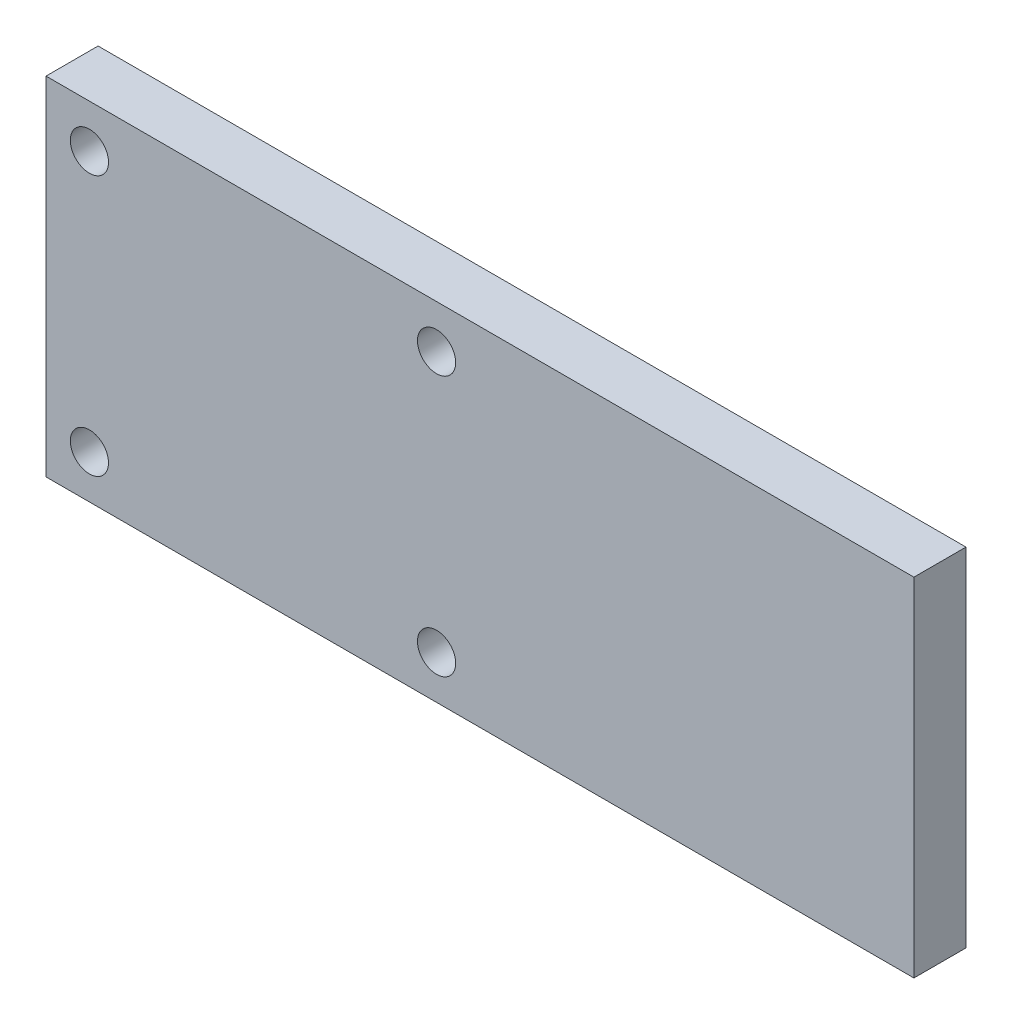
ISO-10303-21;
HEADER;
FILE_DESCRIPTION(('STEP AP214'),'2;1');
FILE_NAME('part.step','',(''),(''),'','','');
FILE_SCHEMA(('AUTOMOTIVE_DESIGN { 1 0 10303 214 1 1 1 1 }'));
ENDSEC;
DATA;
#1=APPLICATION_CONTEXT('core data for automotive mechanical design processes');
#2=APPLICATION_PROTOCOL_DEFINITION('international standard','automotive_design',2000,#1);
#3=PRODUCT_CONTEXT('',#1,'mechanical');
#4=PRODUCT('Part','Part','',(#3));
#5=PRODUCT_RELATED_PRODUCT_CATEGORY('part','',(#4));
#6=PRODUCT_DEFINITION_FORMATION('','',#4);
#7=PRODUCT_DEFINITION_CONTEXT('part definition',#1,'design');
#8=PRODUCT_DEFINITION('design','',#6,#7);
#9=PRODUCT_DEFINITION_SHAPE('','',#8);
#10=(LENGTH_UNIT() NAMED_UNIT(*) SI_UNIT(.MILLI.,.METRE.));
#11=(NAMED_UNIT(*) PLANE_ANGLE_UNIT() SI_UNIT($,.RADIAN.));
#12=(NAMED_UNIT(*) SI_UNIT($,.STERADIAN.) SOLID_ANGLE_UNIT());
#13=UNCERTAINTY_MEASURE_WITH_UNIT(LENGTH_MEASURE(1.E-05),#10,'distance_accuracy_value','');
#14=(GEOMETRIC_REPRESENTATION_CONTEXT(3) GLOBAL_UNCERTAINTY_ASSIGNED_CONTEXT((#13)) GLOBAL_UNIT_ASSIGNED_CONTEXT((#10,
#11,#12)) REPRESENTATION_CONTEXT('',''));
#15=CARTESIAN_POINT('',(0.,0.,0.));
#16=DIRECTION('',(0.,0.,1.));
#17=DIRECTION('',(1.,0.,0.));
#18=AXIS2_PLACEMENT_3D('',#15,#16,#17);
#19=CARTESIAN_POINT('',(115.,54.,3.));
#20=DIRECTION('',(0.,1.,0.));
#21=DIRECTION('',(-1.,0.,0.));
#22=AXIS2_PLACEMENT_3D('',#19,#20,#21);
#23=PLANE('',#22);
#24=DIRECTION('',(-1.,0.,0.));
#25=VECTOR('',#24,1.);
#26=CARTESIAN_POINT('',(115.,54.,9.));
#27=LINE('',#26,#25);
#28=CARTESIAN_POINT('',(115.,54.,9.));
#29=VERTEX_POINT('',#28);
#30=CARTESIAN_POINT('',(14.9999999999999,54.,9.));
#31=VERTEX_POINT('',#30);
#32=EDGE_CURVE('E95',#29,#31,#27,.T.);
#33=ORIENTED_EDGE('',*,*,#32,.F.);
#34=DIRECTION('',(0.,0.,1.));
#35=VECTOR('',#34,1.);
#36=CARTESIAN_POINT('',(115.,54.,3.));
#37=LINE('',#36,#35);
#38=CARTESIAN_POINT('',(115.,54.,3.));
#39=VERTEX_POINT('',#38);
#40=EDGE_CURVE('E11',#39,#29,#37,.T.);
#41=ORIENTED_EDGE('',*,*,#40,.F.);
#42=DIRECTION('',(-1.,0.,0.));
#43=VECTOR('',#42,1.);
#44=CARTESIAN_POINT('',(115.,54.,3.));
#45=LINE('',#44,#43);
#46=CARTESIAN_POINT('',(14.9999999999999,54.,3.));
#47=VERTEX_POINT('',#46);
#48=EDGE_CURVE('E88',#39,#47,#45,.T.);
#49=ORIENTED_EDGE('',*,*,#48,.T.);
#50=DIRECTION('',(0.,0.,1.));
#51=VECTOR('',#50,1.);
#52=CARTESIAN_POINT('',(14.9999999999999,54.,3.));
#53=LINE('',#52,#51);
#54=EDGE_CURVE('E33',#47,#31,#53,.T.);
#55=ORIENTED_EDGE('',*,*,#54,.T.);
#56=EDGE_LOOP('',(#33,#41,#49,#55));
#57=FACE_BOUND('',#56,.T.);
#58=ADVANCED_FACE('F30',(#57),#23,.T.);
#59=CARTESIAN_POINT('',(115.,14.,3.));
#60=DIRECTION('',(1.,0.,0.));
#61=DIRECTION('',(0.,0.,-1.));
#62=AXIS2_PLACEMENT_3D('',#59,#60,#61);
#63=PLANE('',#62);
#64=DIRECTION('',(0.,1.,0.));
#65=VECTOR('',#64,1.);
#66=CARTESIAN_POINT('',(115.,14.,9.));
#67=LINE('',#66,#65);
#68=CARTESIAN_POINT('',(115.,14.,9.));
#69=VERTEX_POINT('',#68);
#70=EDGE_CURVE('E90',#69,#29,#67,.T.);
#71=ORIENTED_EDGE('',*,*,#70,.F.);
#72=DIRECTION('',(0.,0.,1.));
#73=VECTOR('',#72,1.);
#74=CARTESIAN_POINT('',(115.,14.,3.));
#75=LINE('',#74,#73);
#76=CARTESIAN_POINT('',(115.,14.,3.));
#77=VERTEX_POINT('',#76);
#78=EDGE_CURVE('E39',#77,#69,#75,.T.);
#79=ORIENTED_EDGE('',*,*,#78,.F.);
#80=DIRECTION('',(0.,1.,0.));
#81=VECTOR('',#80,1.);
#82=CARTESIAN_POINT('',(115.,14.,3.));
#83=LINE('',#82,#81);
#84=EDGE_CURVE('E85',#77,#39,#83,.T.);
#85=ORIENTED_EDGE('',*,*,#84,.T.);
#86=ORIENTED_EDGE('',*,*,#40,.T.);
#87=EDGE_LOOP('',(#71,#79,#85,#86));
#88=FACE_BOUND('',#87,.T.);
#89=ADVANCED_FACE('F106',(#88),#63,.T.);
#90=CARTESIAN_POINT('',(14.9999999999999,14.,3.));
#91=DIRECTION('',(0.,-1.,0.));
#92=DIRECTION('',(1.,0.,0.));
#93=AXIS2_PLACEMENT_3D('',#90,#91,#92);
#94=PLANE('',#93);
#95=DIRECTION('',(1.,0.,0.));
#96=VECTOR('',#95,1.);
#97=CARTESIAN_POINT('',(14.9999999999999,14.,9.));
#98=LINE('',#97,#96);
#99=CARTESIAN_POINT('',(14.9999999999999,14.,9.));
#100=VERTEX_POINT('',#99);
#101=EDGE_CURVE('E80',#100,#69,#98,.T.);
#102=ORIENTED_EDGE('',*,*,#101,.F.);
#103=DIRECTION('',(0.,0.,1.));
#104=VECTOR('',#103,1.);
#105=CARTESIAN_POINT('',(14.9999999999999,14.,3.));
#106=LINE('',#105,#104);
#107=CARTESIAN_POINT('',(14.9999999999999,14.,3.));
#108=VERTEX_POINT('',#107);
#109=EDGE_CURVE('E75',#108,#100,#106,.T.);
#110=ORIENTED_EDGE('',*,*,#109,.F.);
#111=DIRECTION('',(1.,0.,0.));
#112=VECTOR('',#111,1.);
#113=CARTESIAN_POINT('',(14.9999999999999,14.,3.));
#114=LINE('',#113,#112);
#115=EDGE_CURVE('E78',#108,#77,#114,.T.);
#116=ORIENTED_EDGE('',*,*,#115,.T.);
#117=ORIENTED_EDGE('',*,*,#78,.T.);
#118=EDGE_LOOP('',(#102,#110,#116,#117));
#119=FACE_BOUND('',#118,.T.);
#120=ADVANCED_FACE('F77',(#119),#94,.T.);
#121=CARTESIAN_POINT('',(14.9999999999999,54.,3.));
#122=DIRECTION('',(-1.,0.,0.));
#123=DIRECTION('',(0.,0.,1.));
#124=AXIS2_PLACEMENT_3D('',#121,#122,#123);
#125=PLANE('',#124);
#126=DIRECTION('',(0.,-1.,0.));
#127=VECTOR('',#126,1.);
#128=CARTESIAN_POINT('',(14.9999999999999,54.,9.));
#129=LINE('',#128,#127);
#130=EDGE_CURVE('E98',#31,#100,#129,.T.);
#131=ORIENTED_EDGE('',*,*,#130,.F.);
#132=ORIENTED_EDGE('',*,*,#54,.F.);
#133=DIRECTION('',(0.,-1.,0.));
#134=VECTOR('',#133,1.);
#135=CARTESIAN_POINT('',(14.9999999999999,54.,3.));
#136=LINE('',#135,#134);
#137=EDGE_CURVE('E84',#47,#108,#136,.T.);
#138=ORIENTED_EDGE('',*,*,#137,.T.);
#139=ORIENTED_EDGE('',*,*,#109,.T.);
#140=EDGE_LOOP('',(#131,#132,#138,#139));
#141=FACE_BOUND('',#140,.T.);
#142=ADVANCED_FACE('F87',(#141),#125,.T.);
#143=CARTESIAN_POINT('',(14.9999999999999,54.,3.));
#144=DIRECTION('',(0.,0.,1.));
#145=DIRECTION('',(1.,0.,0.));
#146=AXIS2_PLACEMENT_3D('',#143,#144,#145);
#147=PLANE('',#146);
#148=CARTESIAN_POINT('',(59.9999999999999,19.,3.));
#149=DIRECTION('',(0.,0.,1.));
#150=DIRECTION('',(-1.,0.,0.));
#151=AXIS2_PLACEMENT_3D('',#148,#149,#150);
#152=CIRCLE('',#151,2.2);
#153=CARTESIAN_POINT('',(62.1999999999999,19.,3.));
#154=VERTEX_POINT('',#153);
#155=EDGE_CURVE('E147',#154,#154,#152,.T.);
#156=ORIENTED_EDGE('',*,*,#155,.T.);
#157=EDGE_LOOP('',(#156));
#158=FACE_BOUND('',#157,.T.);
#159=CARTESIAN_POINT('',(19.9999999999999,49.,3.));
#160=DIRECTION('',(0.,0.,1.));
#161=DIRECTION('',(-1.,0.,0.));
#162=AXIS2_PLACEMENT_3D('',#159,#160,#161);
#163=CIRCLE('',#162,2.2);
#164=CARTESIAN_POINT('',(22.1999999999999,49.,3.));
#165=VERTEX_POINT('',#164);
#166=EDGE_CURVE('E155',#165,#165,#163,.T.);
#167=ORIENTED_EDGE('',*,*,#166,.T.);
#168=EDGE_LOOP('',(#167));
#169=FACE_BOUND('',#168,.T.);
#170=CARTESIAN_POINT('',(19.9999999999999,19.,3.));
#171=DIRECTION('',(0.,0.,1.));
#172=DIRECTION('',(-1.,0.,0.));
#173=AXIS2_PLACEMENT_3D('',#170,#171,#172);
#174=CIRCLE('',#173,2.2);
#175=CARTESIAN_POINT('',(22.1999999999999,19.,3.));
#176=VERTEX_POINT('',#175);
#177=EDGE_CURVE('E161',#176,#176,#174,.T.);
#178=ORIENTED_EDGE('',*,*,#177,.T.);
#179=EDGE_LOOP('',(#178));
#180=FACE_BOUND('',#179,.T.);
#181=CARTESIAN_POINT('',(59.9999999999999,49.,3.));
#182=DIRECTION('',(0.,0.,1.));
#183=DIRECTION('',(-1.,0.,0.));
#184=AXIS2_PLACEMENT_3D('',#181,#182,#183);
#185=CIRCLE('',#184,2.2);
#186=CARTESIAN_POINT('',(62.1999999999999,49.,3.));
#187=VERTEX_POINT('',#186);
#188=EDGE_CURVE('E99',#187,#187,#185,.T.);
#189=ORIENTED_EDGE('',*,*,#188,.T.);
#190=EDGE_LOOP('',(#189));
#191=FACE_BOUND('',#190,.T.);
#192=ORIENTED_EDGE('',*,*,#48,.F.);
#193=ORIENTED_EDGE('',*,*,#84,.F.);
#194=ORIENTED_EDGE('',*,*,#115,.F.);
#195=ORIENTED_EDGE('',*,*,#137,.F.);
#196=EDGE_LOOP('',(#192,#193,#194,#195));
#197=FACE_BOUND('',#196,.T.);
#198=ADVANCED_FACE('F83',(#158,#169,#180,#191,#197),#147,.F.);
#199=CARTESIAN_POINT('',(14.9999999999999,54.,9.));
#200=DIRECTION('',(0.,0.,1.));
#201=DIRECTION('',(1.,0.,0.));
#202=AXIS2_PLACEMENT_3D('',#199,#200,#201);
#203=PLANE('',#202);
#204=CARTESIAN_POINT('',(59.9999999999999,19.,9.));
#205=DIRECTION('',(0.,0.,1.));
#206=DIRECTION('',(-1.,0.,0.));
#207=AXIS2_PLACEMENT_3D('',#204,#205,#206);
#208=CIRCLE('',#207,2.2);
#209=CARTESIAN_POINT('',(62.1999999999999,19.,9.));
#210=VERTEX_POINT('',#209);
#211=EDGE_CURVE('E150',#210,#210,#208,.T.);
#212=ORIENTED_EDGE('',*,*,#211,.F.);
#213=EDGE_LOOP('',(#212));
#214=FACE_BOUND('',#213,.T.);
#215=CARTESIAN_POINT('',(19.9999999999999,49.,9.));
#216=DIRECTION('',(0.,0.,1.));
#217=DIRECTION('',(-1.,0.,0.));
#218=AXIS2_PLACEMENT_3D('',#215,#216,#217);
#219=CIRCLE('',#218,2.2);
#220=CARTESIAN_POINT('',(22.1999999999999,49.,9.));
#221=VERTEX_POINT('',#220);
#222=EDGE_CURVE('E152',#221,#221,#219,.T.);
#223=ORIENTED_EDGE('',*,*,#222,.F.);
#224=EDGE_LOOP('',(#223));
#225=FACE_BOUND('',#224,.T.);
#226=CARTESIAN_POINT('',(19.9999999999999,19.,9.));
#227=DIRECTION('',(0.,0.,1.));
#228=DIRECTION('',(-1.,0.,0.));
#229=AXIS2_PLACEMENT_3D('',#226,#227,#228);
#230=CIRCLE('',#229,2.2);
#231=CARTESIAN_POINT('',(22.1999999999999,19.,9.));
#232=VERTEX_POINT('',#231);
#233=EDGE_CURVE('E158',#232,#232,#230,.T.);
#234=ORIENTED_EDGE('',*,*,#233,.F.);
#235=EDGE_LOOP('',(#234));
#236=FACE_BOUND('',#235,.T.);
#237=CARTESIAN_POINT('',(59.9999999999999,49.,9.));
#238=DIRECTION('',(0.,0.,1.));
#239=DIRECTION('',(-1.,0.,0.));
#240=AXIS2_PLACEMENT_3D('',#237,#238,#239);
#241=CIRCLE('',#240,2.2);
#242=CARTESIAN_POINT('',(62.1999999999999,49.,9.));
#243=VERTEX_POINT('',#242);
#244=EDGE_CURVE('E164',#243,#243,#241,.T.);
#245=ORIENTED_EDGE('',*,*,#244,.F.);
#246=EDGE_LOOP('',(#245));
#247=FACE_BOUND('',#246,.T.);
#248=ORIENTED_EDGE('',*,*,#32,.T.);
#249=ORIENTED_EDGE('',*,*,#130,.T.);
#250=ORIENTED_EDGE('',*,*,#101,.T.);
#251=ORIENTED_EDGE('',*,*,#70,.T.);
#252=EDGE_LOOP('',(#248,#249,#250,#251));
#253=FACE_BOUND('',#252,.T.);
#254=ADVANCED_FACE('F105',(#214,#225,#236,#247,#253),#203,.T.);
#255=CARTESIAN_POINT('',(59.9999999999999,49.,3.));
#256=DIRECTION('',(0.,0.,1.));
#257=DIRECTION('',(1.,0.,0.));
#258=AXIS2_PLACEMENT_3D('',#255,#256,#257);
#259=CYLINDRICAL_SURFACE('',#258,2.2);
#260=CARTESIAN_POINT('',(62.1999999999999,49.,3.));
#261=CARTESIAN_POINT('',(62.1999999999999,49.,3.0625));
#262=CARTESIAN_POINT('',(62.1999999999999,49.,3.125));
#263=CARTESIAN_POINT('',(62.1999999999999,49.,3.25));
#264=CARTESIAN_POINT('',(62.1999999999999,49.,3.3125));
#265=CARTESIAN_POINT('',(62.1999999999999,49.,3.4375));
#266=CARTESIAN_POINT('',(62.1999999999999,49.,3.5));
#267=CARTESIAN_POINT('',(62.1999999999999,49.,3.625));
#268=CARTESIAN_POINT('',(62.1999999999999,49.,3.6875));
#269=CARTESIAN_POINT('',(62.1999999999999,49.,3.8125));
#270=CARTESIAN_POINT('',(62.1999999999999,49.,3.875));
#271=CARTESIAN_POINT('',(62.1999999999999,49.,4.));
#272=CARTESIAN_POINT('',(62.1999999999999,49.,4.0625));
#273=CARTESIAN_POINT('',(62.1999999999999,49.,4.1875));
#274=CARTESIAN_POINT('',(62.1999999999999,49.,4.25));
#275=CARTESIAN_POINT('',(62.1999999999999,49.,4.375));
#276=CARTESIAN_POINT('',(62.1999999999999,49.,4.4375));
#277=CARTESIAN_POINT('',(62.1999999999999,49.,4.5625));
#278=CARTESIAN_POINT('',(62.1999999999999,49.,4.625));
#279=CARTESIAN_POINT('',(62.1999999999999,49.,4.75));
#280=CARTESIAN_POINT('',(62.1999999999999,49.,4.8125));
#281=CARTESIAN_POINT('',(62.1999999999999,49.,4.9375));
#282=CARTESIAN_POINT('',(62.1999999999999,49.,5.));
#283=CARTESIAN_POINT('',(62.1999999999999,49.,5.125));
#284=CARTESIAN_POINT('',(62.1999999999999,49.,5.1875));
#285=CARTESIAN_POINT('',(62.1999999999999,49.,5.3125));
#286=CARTESIAN_POINT('',(62.1999999999999,49.,5.375));
#287=CARTESIAN_POINT('',(62.1999999999999,49.,5.5));
#288=CARTESIAN_POINT('',(62.1999999999999,49.,5.5625));
#289=CARTESIAN_POINT('',(62.1999999999999,49.,5.6875));
#290=CARTESIAN_POINT('',(62.1999999999999,49.,5.75));
#291=CARTESIAN_POINT('',(62.1999999999999,49.,5.875));
#292=CARTESIAN_POINT('',(62.1999999999999,49.,5.9375));
#293=CARTESIAN_POINT('',(62.1999999999999,49.,6.0625));
#294=CARTESIAN_POINT('',(62.1999999999999,49.,6.125));
#295=CARTESIAN_POINT('',(62.1999999999999,49.,6.25));
#296=CARTESIAN_POINT('',(62.1999999999999,49.,6.3125));
#297=CARTESIAN_POINT('',(62.1999999999999,49.,6.4375));
#298=CARTESIAN_POINT('',(62.1999999999999,49.,6.5));
#299=CARTESIAN_POINT('',(62.1999999999999,49.,6.625));
#300=CARTESIAN_POINT('',(62.1999999999999,49.,6.6875));
#301=CARTESIAN_POINT('',(62.1999999999999,49.,6.8125));
#302=CARTESIAN_POINT('',(62.1999999999999,49.,6.875));
#303=CARTESIAN_POINT('',(62.1999999999999,49.,7.));
#304=CARTESIAN_POINT('',(62.1999999999999,49.,7.0625));
#305=CARTESIAN_POINT('',(62.1999999999999,49.,7.1875));
#306=CARTESIAN_POINT('',(62.1999999999999,49.,7.25));
#307=CARTESIAN_POINT('',(62.1999999999999,49.,7.375));
#308=CARTESIAN_POINT('',(62.1999999999999,49.,7.4375));
#309=CARTESIAN_POINT('',(62.1999999999999,49.,7.5625));
#310=CARTESIAN_POINT('',(62.1999999999999,49.,7.625));
#311=CARTESIAN_POINT('',(62.1999999999999,49.,7.75));
#312=CARTESIAN_POINT('',(62.1999999999999,49.,7.8125));
#313=CARTESIAN_POINT('',(62.1999999999999,49.,7.9375));
#314=CARTESIAN_POINT('',(62.1999999999999,49.,8.));
#315=CARTESIAN_POINT('',(62.1999999999999,49.,8.125));
#316=CARTESIAN_POINT('',(62.1999999999999,49.,8.1875));
#317=CARTESIAN_POINT('',(62.1999999999999,49.,8.3125));
#318=CARTESIAN_POINT('',(62.1999999999999,49.,8.375));
#319=CARTESIAN_POINT('',(62.1999999999999,49.,8.5));
#320=CARTESIAN_POINT('',(62.1999999999999,49.,8.5625));
#321=CARTESIAN_POINT('',(62.1999999999999,49.,8.6875));
#322=CARTESIAN_POINT('',(62.1999999999999,49.,8.75));
#323=CARTESIAN_POINT('',(62.1999999999999,49.,8.875));
#324=CARTESIAN_POINT('',(62.1999999999999,49.,8.9375));
#325=CARTESIAN_POINT('',(62.1999999999999,49.,9.));
#326=B_SPLINE_CURVE_WITH_KNOTS('',3,(#260,#261,#262,#263,#264,#265,#266,#267,#268,#269,#270,
#271,#272,#273,#274,#275,#276,#277,#278,#279,#280,#281,#282,#283,#284,#285,#286,#287,#288,#289,
#290,#291,#292,#293,#294,#295,#296,#297,#298,#299,#300,#301,#302,#303,#304,#305,#306,#307,#308,
#309,#310,#311,#312,#313,#314,#315,#316,#317,#318,#319,#320,#321,#322,#323,#324,#325),
.UNSPECIFIED.,.F.,.F.,(4,2,2,2,2,2,2,2,2,2,2,2,2,2,2,2,2,2,2,2,2,2,2,2,2,2,2,2,2,2,2,2,4),(0.,
0.1875,0.375,0.5625,0.75,0.9375,1.125,1.3125,1.5,1.6875,1.875,2.0625,2.25,2.4375,2.625,2.8125,
3.,3.1875,3.375,3.5625,3.75,3.9375,4.125,4.3125,4.5,4.6875,4.875,5.0625,5.25,5.4375,5.625,
5.8125,6.),.UNSPECIFIED.);
#327=EDGE_CURVE('BSEAM124',#187,#243,#326,.T.);
#328=ORIENTED_EDGE('',*,*,#188,.F.);
#329=ORIENTED_EDGE('',*,*,#244,.T.);
#330=ORIENTED_EDGE('',*,*,#327,.T.);
#331=ORIENTED_EDGE('',*,*,#327,.F.);
#332=EDGE_LOOP('',(#328,#330,#329,#331));
#333=FACE_BOUND('',#332,.T.);
#334=ADVANCED_FACE('F124',(#333),#259,.F.);
#335=CARTESIAN_POINT('',(19.9999999999999,19.,3.));
#336=DIRECTION('',(0.,0.,1.));
#337=DIRECTION('',(1.,0.,0.));
#338=AXIS2_PLACEMENT_3D('',#335,#336,#337);
#339=CYLINDRICAL_SURFACE('',#338,2.2);
#340=CARTESIAN_POINT('',(22.1999999999999,19.,3.));
#341=CARTESIAN_POINT('',(22.1999999999999,19.,3.0625));
#342=CARTESIAN_POINT('',(22.1999999999999,19.,3.125));
#343=CARTESIAN_POINT('',(22.1999999999999,19.,3.25));
#344=CARTESIAN_POINT('',(22.1999999999999,19.,3.3125));
#345=CARTESIAN_POINT('',(22.1999999999999,19.,3.4375));
#346=CARTESIAN_POINT('',(22.1999999999999,19.,3.5));
#347=CARTESIAN_POINT('',(22.1999999999999,19.,3.625));
#348=CARTESIAN_POINT('',(22.1999999999999,19.,3.6875));
#349=CARTESIAN_POINT('',(22.1999999999999,19.,3.8125));
#350=CARTESIAN_POINT('',(22.1999999999999,19.,3.875));
#351=CARTESIAN_POINT('',(22.1999999999999,19.,4.));
#352=CARTESIAN_POINT('',(22.1999999999999,19.,4.0625));
#353=CARTESIAN_POINT('',(22.1999999999999,19.,4.1875));
#354=CARTESIAN_POINT('',(22.1999999999999,19.,4.25));
#355=CARTESIAN_POINT('',(22.1999999999999,19.,4.375));
#356=CARTESIAN_POINT('',(22.1999999999999,19.,4.4375));
#357=CARTESIAN_POINT('',(22.1999999999999,19.,4.5625));
#358=CARTESIAN_POINT('',(22.1999999999999,19.,4.625));
#359=CARTESIAN_POINT('',(22.1999999999999,19.,4.75));
#360=CARTESIAN_POINT('',(22.1999999999999,19.,4.8125));
#361=CARTESIAN_POINT('',(22.1999999999999,19.,4.9375));
#362=CARTESIAN_POINT('',(22.1999999999999,19.,5.));
#363=CARTESIAN_POINT('',(22.1999999999999,19.,5.125));
#364=CARTESIAN_POINT('',(22.1999999999999,19.,5.1875));
#365=CARTESIAN_POINT('',(22.1999999999999,19.,5.3125));
#366=CARTESIAN_POINT('',(22.1999999999999,19.,5.375));
#367=CARTESIAN_POINT('',(22.1999999999999,19.,5.5));
#368=CARTESIAN_POINT('',(22.1999999999999,19.,5.5625));
#369=CARTESIAN_POINT('',(22.1999999999999,19.,5.6875));
#370=CARTESIAN_POINT('',(22.1999999999999,19.,5.75));
#371=CARTESIAN_POINT('',(22.1999999999999,19.,5.875));
#372=CARTESIAN_POINT('',(22.1999999999999,19.,5.9375));
#373=CARTESIAN_POINT('',(22.1999999999999,19.,6.0625));
#374=CARTESIAN_POINT('',(22.1999999999999,19.,6.125));
#375=CARTESIAN_POINT('',(22.1999999999999,19.,6.25));
#376=CARTESIAN_POINT('',(22.1999999999999,19.,6.3125));
#377=CARTESIAN_POINT('',(22.1999999999999,19.,6.4375));
#378=CARTESIAN_POINT('',(22.1999999999999,19.,6.5));
#379=CARTESIAN_POINT('',(22.1999999999999,19.,6.625));
#380=CARTESIAN_POINT('',(22.1999999999999,19.,6.6875));
#381=CARTESIAN_POINT('',(22.1999999999999,19.,6.8125));
#382=CARTESIAN_POINT('',(22.1999999999999,19.,6.875));
#383=CARTESIAN_POINT('',(22.1999999999999,19.,7.));
#384=CARTESIAN_POINT('',(22.1999999999999,19.,7.0625));
#385=CARTESIAN_POINT('',(22.1999999999999,19.,7.1875));
#386=CARTESIAN_POINT('',(22.1999999999999,19.,7.25));
#387=CARTESIAN_POINT('',(22.1999999999999,19.,7.375));
#388=CARTESIAN_POINT('',(22.1999999999999,19.,7.4375));
#389=CARTESIAN_POINT('',(22.1999999999999,19.,7.5625));
#390=CARTESIAN_POINT('',(22.1999999999999,19.,7.625));
#391=CARTESIAN_POINT('',(22.1999999999999,19.,7.75));
#392=CARTESIAN_POINT('',(22.1999999999999,19.,7.8125));
#393=CARTESIAN_POINT('',(22.1999999999999,19.,7.9375));
#394=CARTESIAN_POINT('',(22.1999999999999,19.,8.));
#395=CARTESIAN_POINT('',(22.1999999999999,19.,8.125));
#396=CARTESIAN_POINT('',(22.1999999999999,19.,8.1875));
#397=CARTESIAN_POINT('',(22.1999999999999,19.,8.3125));
#398=CARTESIAN_POINT('',(22.1999999999999,19.,8.375));
#399=CARTESIAN_POINT('',(22.1999999999999,19.,8.5));
#400=CARTESIAN_POINT('',(22.1999999999999,19.,8.5625));
#401=CARTESIAN_POINT('',(22.1999999999999,19.,8.6875));
#402=CARTESIAN_POINT('',(22.1999999999999,19.,8.75));
#403=CARTESIAN_POINT('',(22.1999999999999,19.,8.875));
#404=CARTESIAN_POINT('',(22.1999999999999,19.,8.9375));
#405=CARTESIAN_POINT('',(22.1999999999999,19.,9.));
#406=B_SPLINE_CURVE_WITH_KNOTS('',3,(#340,#341,#342,#343,#344,#345,#346,#347,#348,#349,#350,
#351,#352,#353,#354,#355,#356,#357,#358,#359,#360,#361,#362,#363,#364,#365,#366,#367,#368,#369,
#370,#371,#372,#373,#374,#375,#376,#377,#378,#379,#380,#381,#382,#383,#384,#385,#386,#387,#388,
#389,#390,#391,#392,#393,#394,#395,#396,#397,#398,#399,#400,#401,#402,#403,#404,#405),
.UNSPECIFIED.,.F.,.F.,(4,2,2,2,2,2,2,2,2,2,2,2,2,2,2,2,2,2,2,2,2,2,2,2,2,2,2,2,2,2,2,2,4),(0.,
0.1875,0.375,0.5625,0.75,0.9375,1.125,1.3125,1.5,1.6875,1.875,2.0625,2.25,2.4375,2.625,2.8125,
3.,3.1875,3.375,3.5625,3.75,3.9375,4.125,4.3125,4.5,4.6875,4.875,5.0625,5.25,5.4375,5.625,
5.8125,6.),.UNSPECIFIED.);
#407=EDGE_CURVE('BSEAM131',#176,#232,#406,.T.);
#408=ORIENTED_EDGE('',*,*,#177,.F.);
#409=ORIENTED_EDGE('',*,*,#233,.T.);
#410=ORIENTED_EDGE('',*,*,#407,.T.);
#411=ORIENTED_EDGE('',*,*,#407,.F.);
#412=EDGE_LOOP('',(#408,#410,#409,#411));
#413=FACE_BOUND('',#412,.T.);
#414=ADVANCED_FACE('F131',(#413),#339,.F.);
#415=CARTESIAN_POINT('',(19.9999999999999,49.,3.));
#416=DIRECTION('',(0.,0.,1.));
#417=DIRECTION('',(1.,0.,0.));
#418=AXIS2_PLACEMENT_3D('',#415,#416,#417);
#419=CYLINDRICAL_SURFACE('',#418,2.2);
#420=CARTESIAN_POINT('',(22.1999999999999,49.,3.));
#421=CARTESIAN_POINT('',(22.1999999999999,49.,3.0625));
#422=CARTESIAN_POINT('',(22.1999999999999,49.,3.125));
#423=CARTESIAN_POINT('',(22.1999999999999,49.,3.25));
#424=CARTESIAN_POINT('',(22.1999999999999,49.,3.3125));
#425=CARTESIAN_POINT('',(22.1999999999999,49.,3.4375));
#426=CARTESIAN_POINT('',(22.1999999999999,49.,3.5));
#427=CARTESIAN_POINT('',(22.1999999999999,49.,3.625));
#428=CARTESIAN_POINT('',(22.1999999999999,49.,3.6875));
#429=CARTESIAN_POINT('',(22.1999999999999,49.,3.8125));
#430=CARTESIAN_POINT('',(22.1999999999999,49.,3.875));
#431=CARTESIAN_POINT('',(22.1999999999999,49.,4.));
#432=CARTESIAN_POINT('',(22.1999999999999,49.,4.0625));
#433=CARTESIAN_POINT('',(22.1999999999999,49.,4.1875));
#434=CARTESIAN_POINT('',(22.1999999999999,49.,4.25));
#435=CARTESIAN_POINT('',(22.1999999999999,49.,4.375));
#436=CARTESIAN_POINT('',(22.1999999999999,49.,4.4375));
#437=CARTESIAN_POINT('',(22.1999999999999,49.,4.5625));
#438=CARTESIAN_POINT('',(22.1999999999999,49.,4.625));
#439=CARTESIAN_POINT('',(22.1999999999999,49.,4.75));
#440=CARTESIAN_POINT('',(22.1999999999999,49.,4.8125));
#441=CARTESIAN_POINT('',(22.1999999999999,49.,4.9375));
#442=CARTESIAN_POINT('',(22.1999999999999,49.,5.));
#443=CARTESIAN_POINT('',(22.1999999999999,49.,5.125));
#444=CARTESIAN_POINT('',(22.1999999999999,49.,5.1875));
#445=CARTESIAN_POINT('',(22.1999999999999,49.,5.3125));
#446=CARTESIAN_POINT('',(22.1999999999999,49.,5.375));
#447=CARTESIAN_POINT('',(22.1999999999999,49.,5.5));
#448=CARTESIAN_POINT('',(22.1999999999999,49.,5.5625));
#449=CARTESIAN_POINT('',(22.1999999999999,49.,5.6875));
#450=CARTESIAN_POINT('',(22.1999999999999,49.,5.75));
#451=CARTESIAN_POINT('',(22.1999999999999,49.,5.875));
#452=CARTESIAN_POINT('',(22.1999999999999,49.,5.9375));
#453=CARTESIAN_POINT('',(22.1999999999999,49.,6.0625));
#454=CARTESIAN_POINT('',(22.1999999999999,49.,6.125));
#455=CARTESIAN_POINT('',(22.1999999999999,49.,6.25));
#456=CARTESIAN_POINT('',(22.1999999999999,49.,6.3125));
#457=CARTESIAN_POINT('',(22.1999999999999,49.,6.4375));
#458=CARTESIAN_POINT('',(22.1999999999999,49.,6.5));
#459=CARTESIAN_POINT('',(22.1999999999999,49.,6.625));
#460=CARTESIAN_POINT('',(22.1999999999999,49.,6.6875));
#461=CARTESIAN_POINT('',(22.1999999999999,49.,6.8125));
#462=CARTESIAN_POINT('',(22.1999999999999,49.,6.875));
#463=CARTESIAN_POINT('',(22.1999999999999,49.,7.));
#464=CARTESIAN_POINT('',(22.1999999999999,49.,7.0625));
#465=CARTESIAN_POINT('',(22.1999999999999,49.,7.1875));
#466=CARTESIAN_POINT('',(22.1999999999999,49.,7.25));
#467=CARTESIAN_POINT('',(22.1999999999999,49.,7.375));
#468=CARTESIAN_POINT('',(22.1999999999999,49.,7.4375));
#469=CARTESIAN_POINT('',(22.1999999999999,49.,7.5625));
#470=CARTESIAN_POINT('',(22.1999999999999,49.,7.625));
#471=CARTESIAN_POINT('',(22.1999999999999,49.,7.75));
#472=CARTESIAN_POINT('',(22.1999999999999,49.,7.8125));
#473=CARTESIAN_POINT('',(22.1999999999999,49.,7.9375));
#474=CARTESIAN_POINT('',(22.1999999999999,49.,8.));
#475=CARTESIAN_POINT('',(22.1999999999999,49.,8.125));
#476=CARTESIAN_POINT('',(22.1999999999999,49.,8.1875));
#477=CARTESIAN_POINT('',(22.1999999999999,49.,8.3125));
#478=CARTESIAN_POINT('',(22.1999999999999,49.,8.375));
#479=CARTESIAN_POINT('',(22.1999999999999,49.,8.5));
#480=CARTESIAN_POINT('',(22.1999999999999,49.,8.5625));
#481=CARTESIAN_POINT('',(22.1999999999999,49.,8.6875));
#482=CARTESIAN_POINT('',(22.1999999999999,49.,8.75));
#483=CARTESIAN_POINT('',(22.1999999999999,49.,8.875));
#484=CARTESIAN_POINT('',(22.1999999999999,49.,8.9375));
#485=CARTESIAN_POINT('',(22.1999999999999,49.,9.));
#486=B_SPLINE_CURVE_WITH_KNOTS('',3,(#420,#421,#422,#423,#424,#425,#426,#427,#428,#429,#430,
#431,#432,#433,#434,#435,#436,#437,#438,#439,#440,#441,#442,#443,#444,#445,#446,#447,#448,#449,
#450,#451,#452,#453,#454,#455,#456,#457,#458,#459,#460,#461,#462,#463,#464,#465,#466,#467,#468,
#469,#470,#471,#472,#473,#474,#475,#476,#477,#478,#479,#480,#481,#482,#483,#484,#485),
.UNSPECIFIED.,.F.,.F.,(4,2,2,2,2,2,2,2,2,2,2,2,2,2,2,2,2,2,2,2,2,2,2,2,2,2,2,2,2,2,2,2,4),(0.,
0.1875,0.375,0.5625,0.75,0.9375,1.125,1.3125,1.5,1.6875,1.875,2.0625,2.25,2.4375,2.625,2.8125,
3.,3.1875,3.375,3.5625,3.75,3.9375,4.125,4.3125,4.5,4.6875,4.875,5.0625,5.25,5.4375,5.625,
5.8125,6.),.UNSPECIFIED.);
#487=EDGE_CURVE('BSEAM135',#165,#221,#486,.T.);
#488=ORIENTED_EDGE('',*,*,#166,.F.);
#489=ORIENTED_EDGE('',*,*,#222,.T.);
#490=ORIENTED_EDGE('',*,*,#487,.T.);
#491=ORIENTED_EDGE('',*,*,#487,.F.);
#492=EDGE_LOOP('',(#488,#490,#489,#491));
#493=FACE_BOUND('',#492,.T.);
#494=ADVANCED_FACE('F135',(#493),#419,.F.);
#495=CARTESIAN_POINT('',(59.9999999999999,19.,3.));
#496=DIRECTION('',(0.,0.,1.));
#497=DIRECTION('',(1.,0.,0.));
#498=AXIS2_PLACEMENT_3D('',#495,#496,#497);
#499=CYLINDRICAL_SURFACE('',#498,2.2);
#500=CARTESIAN_POINT('',(62.1999999999999,19.,3.));
#501=CARTESIAN_POINT('',(62.1999999999999,19.,3.0625));
#502=CARTESIAN_POINT('',(62.1999999999999,19.,3.125));
#503=CARTESIAN_POINT('',(62.1999999999999,19.,3.25));
#504=CARTESIAN_POINT('',(62.1999999999999,19.,3.3125));
#505=CARTESIAN_POINT('',(62.1999999999999,19.,3.4375));
#506=CARTESIAN_POINT('',(62.1999999999999,19.,3.5));
#507=CARTESIAN_POINT('',(62.1999999999999,19.,3.625));
#508=CARTESIAN_POINT('',(62.1999999999999,19.,3.6875));
#509=CARTESIAN_POINT('',(62.1999999999999,19.,3.8125));
#510=CARTESIAN_POINT('',(62.1999999999999,19.,3.875));
#511=CARTESIAN_POINT('',(62.1999999999999,19.,4.));
#512=CARTESIAN_POINT('',(62.1999999999999,19.,4.0625));
#513=CARTESIAN_POINT('',(62.1999999999999,19.,4.1875));
#514=CARTESIAN_POINT('',(62.1999999999999,19.,4.25));
#515=CARTESIAN_POINT('',(62.1999999999999,19.,4.375));
#516=CARTESIAN_POINT('',(62.1999999999999,19.,4.4375));
#517=CARTESIAN_POINT('',(62.1999999999999,19.,4.5625));
#518=CARTESIAN_POINT('',(62.1999999999999,19.,4.625));
#519=CARTESIAN_POINT('',(62.1999999999999,19.,4.75));
#520=CARTESIAN_POINT('',(62.1999999999999,19.,4.8125));
#521=CARTESIAN_POINT('',(62.1999999999999,19.,4.9375));
#522=CARTESIAN_POINT('',(62.1999999999999,19.,5.));
#523=CARTESIAN_POINT('',(62.1999999999999,19.,5.125));
#524=CARTESIAN_POINT('',(62.1999999999999,19.,5.1875));
#525=CARTESIAN_POINT('',(62.1999999999999,19.,5.3125));
#526=CARTESIAN_POINT('',(62.1999999999999,19.,5.375));
#527=CARTESIAN_POINT('',(62.1999999999999,19.,5.5));
#528=CARTESIAN_POINT('',(62.1999999999999,19.,5.5625));
#529=CARTESIAN_POINT('',(62.1999999999999,19.,5.6875));
#530=CARTESIAN_POINT('',(62.1999999999999,19.,5.75));
#531=CARTESIAN_POINT('',(62.1999999999999,19.,5.875));
#532=CARTESIAN_POINT('',(62.1999999999999,19.,5.9375));
#533=CARTESIAN_POINT('',(62.1999999999999,19.,6.0625));
#534=CARTESIAN_POINT('',(62.1999999999999,19.,6.125));
#535=CARTESIAN_POINT('',(62.1999999999999,19.,6.25));
#536=CARTESIAN_POINT('',(62.1999999999999,19.,6.3125));
#537=CARTESIAN_POINT('',(62.1999999999999,19.,6.4375));
#538=CARTESIAN_POINT('',(62.1999999999999,19.,6.5));
#539=CARTESIAN_POINT('',(62.1999999999999,19.,6.625));
#540=CARTESIAN_POINT('',(62.1999999999999,19.,6.6875));
#541=CARTESIAN_POINT('',(62.1999999999999,19.,6.8125));
#542=CARTESIAN_POINT('',(62.1999999999999,19.,6.875));
#543=CARTESIAN_POINT('',(62.1999999999999,19.,7.));
#544=CARTESIAN_POINT('',(62.1999999999999,19.,7.0625));
#545=CARTESIAN_POINT('',(62.1999999999999,19.,7.1875));
#546=CARTESIAN_POINT('',(62.1999999999999,19.,7.25));
#547=CARTESIAN_POINT('',(62.1999999999999,19.,7.375));
#548=CARTESIAN_POINT('',(62.1999999999999,19.,7.4375));
#549=CARTESIAN_POINT('',(62.1999999999999,19.,7.5625));
#550=CARTESIAN_POINT('',(62.1999999999999,19.,7.625));
#551=CARTESIAN_POINT('',(62.1999999999999,19.,7.75));
#552=CARTESIAN_POINT('',(62.1999999999999,19.,7.8125));
#553=CARTESIAN_POINT('',(62.1999999999999,19.,7.9375));
#554=CARTESIAN_POINT('',(62.1999999999999,19.,8.));
#555=CARTESIAN_POINT('',(62.1999999999999,19.,8.125));
#556=CARTESIAN_POINT('',(62.1999999999999,19.,8.1875));
#557=CARTESIAN_POINT('',(62.1999999999999,19.,8.3125));
#558=CARTESIAN_POINT('',(62.1999999999999,19.,8.375));
#559=CARTESIAN_POINT('',(62.1999999999999,19.,8.5));
#560=CARTESIAN_POINT('',(62.1999999999999,19.,8.5625));
#561=CARTESIAN_POINT('',(62.1999999999999,19.,8.6875));
#562=CARTESIAN_POINT('',(62.1999999999999,19.,8.75));
#563=CARTESIAN_POINT('',(62.1999999999999,19.,8.875));
#564=CARTESIAN_POINT('',(62.1999999999999,19.,8.9375));
#565=CARTESIAN_POINT('',(62.1999999999999,19.,9.));
#566=B_SPLINE_CURVE_WITH_KNOTS('',3,(#500,#501,#502,#503,#504,#505,#506,#507,#508,#509,#510,
#511,#512,#513,#514,#515,#516,#517,#518,#519,#520,#521,#522,#523,#524,#525,#526,#527,#528,#529,
#530,#531,#532,#533,#534,#535,#536,#537,#538,#539,#540,#541,#542,#543,#544,#545,#546,#547,#548,
#549,#550,#551,#552,#553,#554,#555,#556,#557,#558,#559,#560,#561,#562,#563,#564,#565),
.UNSPECIFIED.,.F.,.F.,(4,2,2,2,2,2,2,2,2,2,2,2,2,2,2,2,2,2,2,2,2,2,2,2,2,2,2,2,2,2,2,2,4),(0.,
0.1875,0.375,0.5625,0.75,0.9375,1.125,1.3125,1.5,1.6875,1.875,2.0625,2.25,2.4375,2.625,2.8125,
3.,3.1875,3.375,3.5625,3.75,3.9375,4.125,4.3125,4.5,4.6875,4.875,5.0625,5.25,5.4375,5.625,
5.8125,6.),.UNSPECIFIED.);
#567=EDGE_CURVE('BSEAM139',#154,#210,#566,.T.);
#568=ORIENTED_EDGE('',*,*,#155,.F.);
#569=ORIENTED_EDGE('',*,*,#211,.T.);
#570=ORIENTED_EDGE('',*,*,#567,.T.);
#571=ORIENTED_EDGE('',*,*,#567,.F.);
#572=EDGE_LOOP('',(#568,#570,#569,#571));
#573=FACE_BOUND('',#572,.T.);
#574=ADVANCED_FACE('F139',(#573),#499,.F.);
#575=CLOSED_SHELL('',(#58,#89,#120,#142,#198,#254,#334,#414,#494,#574));
#576=MANIFOLD_SOLID_BREP('B2',#575);
#577=ADVANCED_BREP_SHAPE_REPRESENTATION('',(#18,#576),#14);
#578=SHAPE_DEFINITION_REPRESENTATION(#9,#577);
ENDSEC;
END-ISO-10303-21;
